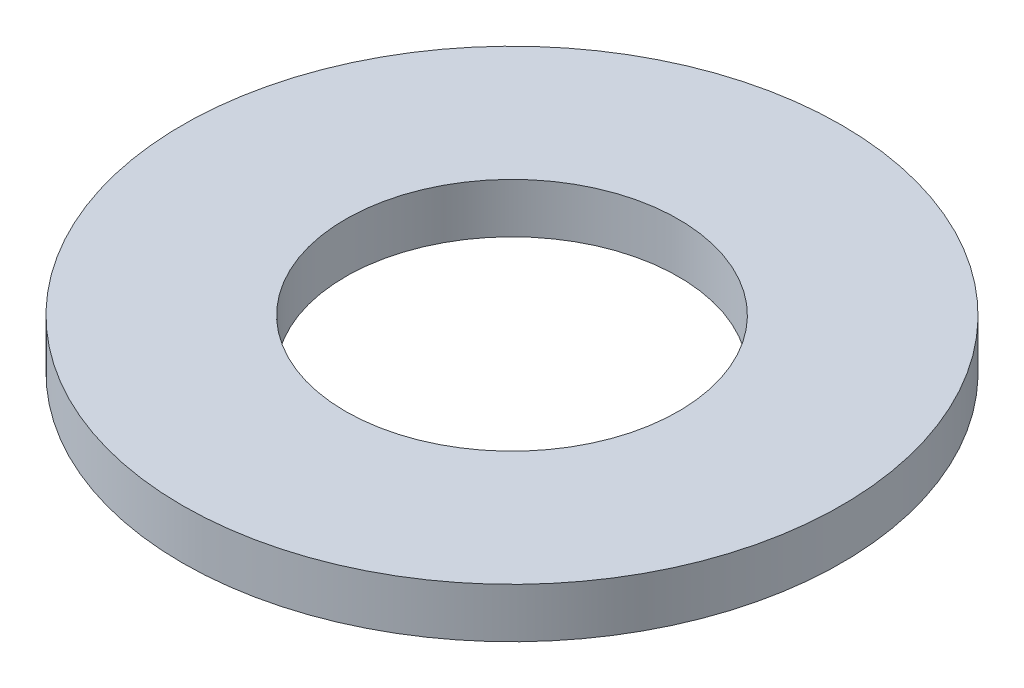
ISO-10303-21;
HEADER;
FILE_DESCRIPTION(('STEP AP214'),'2;1');
FILE_NAME('part.step','',(''),(''),'','','');
FILE_SCHEMA(('AUTOMOTIVE_DESIGN { 1 0 10303 214 1 1 1 1 }'));
ENDSEC;
DATA;
#1=APPLICATION_CONTEXT('core data for automotive mechanical design processes');
#2=APPLICATION_PROTOCOL_DEFINITION('international standard','automotive_design',2000,#1);
#3=PRODUCT_CONTEXT('',#1,'mechanical');
#4=PRODUCT('Part','Part','',(#3));
#5=PRODUCT_RELATED_PRODUCT_CATEGORY('part','',(#4));
#6=PRODUCT_DEFINITION_FORMATION('','',#4);
#7=PRODUCT_DEFINITION_CONTEXT('part definition',#1,'design');
#8=PRODUCT_DEFINITION('design','',#6,#7);
#9=PRODUCT_DEFINITION_SHAPE('','',#8);
#10=(LENGTH_UNIT() NAMED_UNIT(*) SI_UNIT(.MILLI.,.METRE.));
#11=(NAMED_UNIT(*) PLANE_ANGLE_UNIT() SI_UNIT($,.RADIAN.));
#12=(NAMED_UNIT(*) SI_UNIT($,.STERADIAN.) SOLID_ANGLE_UNIT());
#13=UNCERTAINTY_MEASURE_WITH_UNIT(LENGTH_MEASURE(1.E-05),#10,'distance_accuracy_value','');
#14=(GEOMETRIC_REPRESENTATION_CONTEXT(3) GLOBAL_UNCERTAINTY_ASSIGNED_CONTEXT((#13)) GLOBAL_UNIT_ASSIGNED_CONTEXT((#10,
#11,#12)) REPRESENTATION_CONTEXT('',''));
#15=CARTESIAN_POINT('',(0.,0.,0.));
#16=DIRECTION('',(0.,0.,1.));
#17=DIRECTION('',(1.,0.,0.));
#18=AXIS2_PLACEMENT_3D('',#15,#16,#17);
#19=CARTESIAN_POINT('',(0.,0.508,0.));
#20=DIRECTION('',(0.,-1.,0.));
#21=DIRECTION('',(0.,0.,-1.));
#22=AXIS2_PLACEMENT_3D('',#19,#20,#21);
#23=CYLINDRICAL_SURFACE('',#22,3.3655);
#24=CARTESIAN_POINT('',(0.,0.508,0.));
#25=DIRECTION('',(0.,1.,0.));
#26=DIRECTION('',(0.,0.,1.));
#27=AXIS2_PLACEMENT_3D('',#24,#25,#26);
#28=CIRCLE('',#27,3.3655);
#29=CARTESIAN_POINT('',(0.,0.508,3.3655));
#30=VERTEX_POINT('',#29);
#31=EDGE_CURVE('E10',#30,#30,#28,.T.);
#32=ORIENTED_EDGE('',*,*,#31,.F.);
#33=EDGE_LOOP('',(#32));
#34=FACE_BOUND('',#33,.T.);
#35=CARTESIAN_POINT('',(0.,0.,0.));
#36=DIRECTION('',(0.,1.,0.));
#37=DIRECTION('',(0.,0.,1.));
#38=AXIS2_PLACEMENT_3D('',#35,#36,#37);
#39=CIRCLE('',#38,3.3655);
#40=CARTESIAN_POINT('',(0.,0.,3.3655));
#41=VERTEX_POINT('',#40);
#42=EDGE_CURVE('E46',#41,#41,#39,.T.);
#43=ORIENTED_EDGE('',*,*,#42,.T.);
#44=EDGE_LOOP('',(#43));
#45=FACE_BOUND('',#44,.T.);
#46=ADVANCED_FACE('F43',(#34,#45),#23,.T.);
#47=CARTESIAN_POINT('',(0.,0.508,0.));
#48=DIRECTION('',(0.,1.,0.));
#49=DIRECTION('',(0.,0.,1.));
#50=AXIS2_PLACEMENT_3D('',#47,#48,#49);
#51=PLANE('',#50);
#52=CARTESIAN_POINT('',(0.,0.508,0.));
#53=DIRECTION('',(0.,1.,0.));
#54=DIRECTION('',(0.,0.,1.));
#55=AXIS2_PLACEMENT_3D('',#52,#53,#54);
#56=CIRCLE('',#55,1.7);
#57=CARTESIAN_POINT('',(0.,0.508,1.7));
#58=VERTEX_POINT('',#57);
#59=EDGE_CURVE('E60',#58,#58,#56,.T.);
#60=ORIENTED_EDGE('',*,*,#59,.F.);
#61=EDGE_LOOP('',(#60));
#62=FACE_BOUND('',#61,.T.);
#63=ORIENTED_EDGE('',*,*,#31,.T.);
#64=EDGE_LOOP('',(#63));
#65=FACE_BOUND('',#64,.T.);
#66=ADVANCED_FACE('F67',(#62,#65),#51,.T.);
#67=CARTESIAN_POINT('',(0.,0.,0.));
#68=DIRECTION('',(0.,1.,0.));
#69=DIRECTION('',(0.,0.,1.));
#70=AXIS2_PLACEMENT_3D('',#67,#68,#69);
#71=PLANE('',#70);
#72=CARTESIAN_POINT('',(0.,0.,0.));
#73=DIRECTION('',(0.,1.,0.));
#74=DIRECTION('',(0.,0.,1.));
#75=AXIS2_PLACEMENT_3D('',#72,#73,#74);
#76=CIRCLE('',#75,1.7);
#77=CARTESIAN_POINT('',(0.,0.,1.7));
#78=VERTEX_POINT('',#77);
#79=EDGE_CURVE('E55',#78,#78,#76,.T.);
#80=ORIENTED_EDGE('',*,*,#79,.T.);
#81=EDGE_LOOP('',(#80));
#82=FACE_BOUND('',#81,.T.);
#83=ORIENTED_EDGE('',*,*,#42,.F.);
#84=EDGE_LOOP('',(#83));
#85=FACE_BOUND('',#84,.T.);
#86=ADVANCED_FACE('F69',(#82,#85),#71,.F.);
#87=CARTESIAN_POINT('',(0.,0.508,0.));
#88=DIRECTION('',(0.,1.,0.));
#89=DIRECTION('',(0.,0.,1.));
#90=AXIS2_PLACEMENT_3D('',#87,#88,#89);
#91=CYLINDRICAL_SURFACE('',#90,1.7);
#92=ORIENTED_EDGE('',*,*,#79,.F.);
#93=EDGE_LOOP('',(#92));
#94=FACE_BOUND('',#93,.T.);
#95=ORIENTED_EDGE('',*,*,#59,.T.);
#96=EDGE_LOOP('',(#95));
#97=FACE_BOUND('',#96,.T.);
#98=ADVANCED_FACE('F65',(#94,#97),#91,.F.);
#99=CLOSED_SHELL('',(#46,#66,#86,#98));
#100=MANIFOLD_SOLID_BREP('B2',#99);
#101=ADVANCED_BREP_SHAPE_REPRESENTATION('',(#18,#100),#14);
#102=SHAPE_DEFINITION_REPRESENTATION(#9,#101);
ENDSEC;
END-ISO-10303-21;
